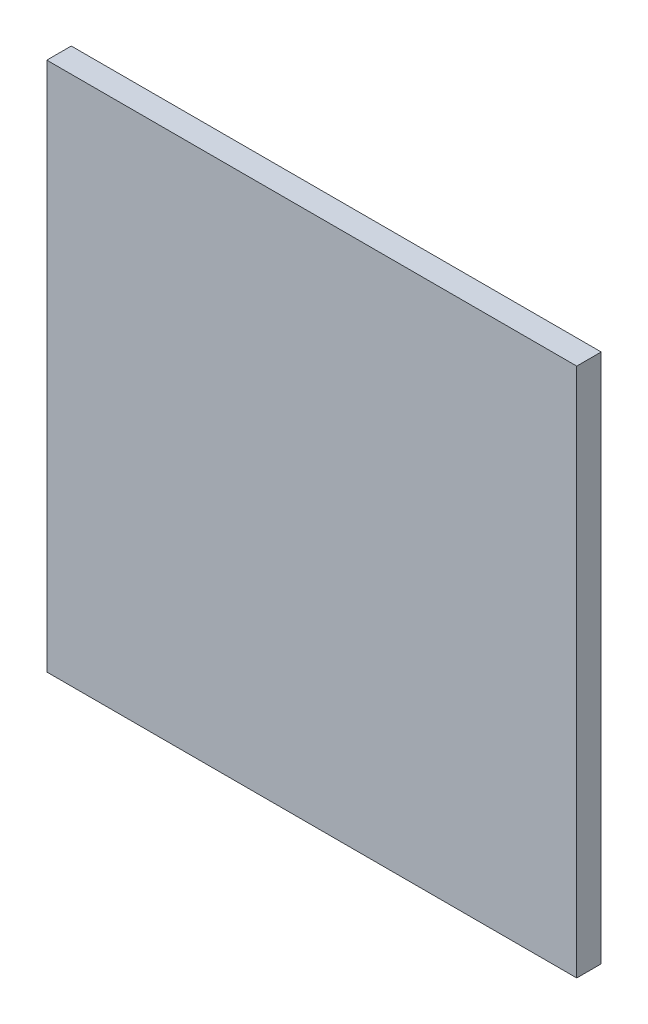
ISO-10303-21;
HEADER;
FILE_DESCRIPTION(('STEP AP214'),'2;1');
FILE_NAME('part.step','',(''),(''),'','','');
FILE_SCHEMA(('AUTOMOTIVE_DESIGN { 1 0 10303 214 1 1 1 1 }'));
ENDSEC;
DATA;
#1=APPLICATION_CONTEXT('core data for automotive mechanical design processes');
#2=APPLICATION_PROTOCOL_DEFINITION('international standard','automotive_design',2000,#1);
#3=PRODUCT_CONTEXT('',#1,'mechanical');
#4=PRODUCT('Part','Part','',(#3));
#5=PRODUCT_RELATED_PRODUCT_CATEGORY('part','',(#4));
#6=PRODUCT_DEFINITION_FORMATION('','',#4);
#7=PRODUCT_DEFINITION_CONTEXT('part definition',#1,'design');
#8=PRODUCT_DEFINITION('design','',#6,#7);
#9=PRODUCT_DEFINITION_SHAPE('','',#8);
#10=(LENGTH_UNIT() NAMED_UNIT(*) SI_UNIT(.MILLI.,.METRE.));
#11=(NAMED_UNIT(*) PLANE_ANGLE_UNIT() SI_UNIT($,.RADIAN.));
#12=(NAMED_UNIT(*) SI_UNIT($,.STERADIAN.) SOLID_ANGLE_UNIT());
#13=UNCERTAINTY_MEASURE_WITH_UNIT(LENGTH_MEASURE(1.E-05),#10,'distance_accuracy_value','');
#14=(GEOMETRIC_REPRESENTATION_CONTEXT(3) GLOBAL_UNCERTAINTY_ASSIGNED_CONTEXT((#13)) GLOBAL_UNIT_ASSIGNED_CONTEXT((#10,
#11,#12)) REPRESENTATION_CONTEXT('',''));
#15=CARTESIAN_POINT('',(0.,0.,0.));
#16=DIRECTION('',(0.,0.,1.));
#17=DIRECTION('',(1.,0.,0.));
#18=AXIS2_PLACEMENT_3D('',#15,#16,#17);
#19=CARTESIAN_POINT('',(32.5,-32.5,3.));
#20=DIRECTION('',(-1.,0.,0.));
#21=DIRECTION('',(0.,0.,1.));
#22=AXIS2_PLACEMENT_3D('',#19,#20,#21);
#23=PLANE('',#22);
#24=DIRECTION('',(0.,1.,0.));
#25=VECTOR('',#24,1.);
#26=CARTESIAN_POINT('',(32.5,-32.5,0.));
#27=LINE('',#26,#25);
#28=CARTESIAN_POINT('',(32.5,-32.5,0.));
#29=VERTEX_POINT('',#28);
#30=CARTESIAN_POINT('',(32.5,32.5,0.));
#31=VERTEX_POINT('',#30);
#32=EDGE_CURVE('E100',#29,#31,#27,.T.);
#33=ORIENTED_EDGE('',*,*,#32,.T.);
#34=DIRECTION('',(0.,0.,-1.));
#35=VECTOR('',#34,1.);
#36=CARTESIAN_POINT('',(32.5,32.5,3.));
#37=LINE('',#36,#35);
#38=CARTESIAN_POINT('',(32.5,32.5,3.));
#39=VERTEX_POINT('',#38);
#40=EDGE_CURVE('E11',#39,#31,#37,.T.);
#41=ORIENTED_EDGE('',*,*,#40,.F.);
#42=DIRECTION('',(0.,1.,0.));
#43=VECTOR('',#42,1.);
#44=CARTESIAN_POINT('',(32.5,-32.5,3.));
#45=LINE('',#44,#43);
#46=CARTESIAN_POINT('',(32.5,-32.5,3.));
#47=VERTEX_POINT('',#46);
#48=EDGE_CURVE('E88',#47,#39,#45,.T.);
#49=ORIENTED_EDGE('',*,*,#48,.F.);
#50=DIRECTION('',(0.,0.,-1.));
#51=VECTOR('',#50,1.);
#52=CARTESIAN_POINT('',(32.5,-32.5,3.));
#53=LINE('',#52,#51);
#54=EDGE_CURVE('E96',#47,#29,#53,.T.);
#55=ORIENTED_EDGE('',*,*,#54,.T.);
#56=EDGE_LOOP('',(#33,#41,#49,#55));
#57=FACE_BOUND('',#56,.T.);
#58=ADVANCED_FACE('F37',(#57),#23,.F.);
#59=CARTESIAN_POINT('',(-32.5,32.5,3.));
#60=DIRECTION('',(0.,-1.,0.));
#61=DIRECTION('',(0.,0.,-1.));
#62=AXIS2_PLACEMENT_3D('',#59,#60,#61);
#63=PLANE('',#62);
#64=DIRECTION('',(-1.,0.,0.));
#65=VECTOR('',#64,1.);
#66=CARTESIAN_POINT('',(-32.5,32.5,0.));
#67=LINE('',#66,#65);
#68=CARTESIAN_POINT('',(-32.5,32.5,0.));
#69=VERTEX_POINT('',#68);
#70=EDGE_CURVE('E92',#31,#69,#67,.T.);
#71=ORIENTED_EDGE('',*,*,#70,.T.);
#72=DIRECTION('',(0.,0.,-1.));
#73=VECTOR('',#72,1.);
#74=CARTESIAN_POINT('',(-32.5,32.5,3.));
#75=LINE('',#74,#73);
#76=CARTESIAN_POINT('',(-32.5,32.5,3.));
#77=VERTEX_POINT('',#76);
#78=EDGE_CURVE('E45',#77,#69,#75,.T.);
#79=ORIENTED_EDGE('',*,*,#78,.F.);
#80=DIRECTION('',(-1.,0.,0.));
#81=VECTOR('',#80,1.);
#82=CARTESIAN_POINT('',(-32.5,32.5,3.));
#83=LINE('',#82,#81);
#84=EDGE_CURVE('E83',#39,#77,#83,.T.);
#85=ORIENTED_EDGE('',*,*,#84,.F.);
#86=ORIENTED_EDGE('',*,*,#40,.T.);
#87=EDGE_LOOP('',(#71,#79,#85,#86));
#88=FACE_BOUND('',#87,.T.);
#89=ADVANCED_FACE('F91',(#88),#63,.F.);
#90=CARTESIAN_POINT('',(-32.5,-32.5,3.));
#91=DIRECTION('',(1.,0.,0.));
#92=DIRECTION('',(0.,0.,-1.));
#93=AXIS2_PLACEMENT_3D('',#90,#91,#92);
#94=PLANE('',#93);
#95=DIRECTION('',(0.,-1.,0.));
#96=VECTOR('',#95,1.);
#97=CARTESIAN_POINT('',(-32.5,-32.5,0.));
#98=LINE('',#97,#96);
#99=CARTESIAN_POINT('',(-32.5,-32.5,0.));
#100=VERTEX_POINT('',#99);
#101=EDGE_CURVE('E70',#69,#100,#98,.T.);
#102=ORIENTED_EDGE('',*,*,#101,.T.);
#103=DIRECTION('',(0.,0.,-1.));
#104=VECTOR('',#103,1.);
#105=CARTESIAN_POINT('',(-32.5,-32.5,3.));
#106=LINE('',#105,#104);
#107=CARTESIAN_POINT('',(-32.5,-32.5,3.));
#108=VERTEX_POINT('',#107);
#109=EDGE_CURVE('E93',#108,#100,#106,.T.);
#110=ORIENTED_EDGE('',*,*,#109,.F.);
#111=DIRECTION('',(0.,-1.,0.));
#112=VECTOR('',#111,1.);
#113=CARTESIAN_POINT('',(-32.5,-32.5,3.));
#114=LINE('',#113,#112);
#115=EDGE_CURVE('E86',#77,#108,#114,.T.);
#116=ORIENTED_EDGE('',*,*,#115,.F.);
#117=ORIENTED_EDGE('',*,*,#78,.T.);
#118=EDGE_LOOP('',(#102,#110,#116,#117));
#119=FACE_BOUND('',#118,.T.);
#120=ADVANCED_FACE('F94',(#119),#94,.F.);
#121=CARTESIAN_POINT('',(-32.5,-32.5,3.));
#122=DIRECTION('',(0.,1.,0.));
#123=DIRECTION('',(0.,0.,1.));
#124=AXIS2_PLACEMENT_3D('',#121,#122,#123);
#125=PLANE('',#124);
#126=DIRECTION('',(1.,0.,0.));
#127=VECTOR('',#126,1.);
#128=CARTESIAN_POINT('',(-32.5,-32.5,0.));
#129=LINE('',#128,#127);
#130=EDGE_CURVE('E76',#100,#29,#129,.T.);
#131=ORIENTED_EDGE('',*,*,#130,.T.);
#132=ORIENTED_EDGE('',*,*,#54,.F.);
#133=DIRECTION('',(1.,0.,0.));
#134=VECTOR('',#133,1.);
#135=CARTESIAN_POINT('',(-32.5,-32.5,3.));
#136=LINE('',#135,#134);
#137=EDGE_CURVE('E53',#108,#47,#136,.T.);
#138=ORIENTED_EDGE('',*,*,#137,.F.);
#139=ORIENTED_EDGE('',*,*,#109,.T.);
#140=EDGE_LOOP('',(#131,#132,#138,#139));
#141=FACE_BOUND('',#140,.T.);
#142=ADVANCED_FACE('F107',(#141),#125,.F.);
#143=CARTESIAN_POINT('',(0.,0.,3.));
#144=DIRECTION('',(0.,0.,-1.));
#145=DIRECTION('',(-1.,0.,0.));
#146=AXIS2_PLACEMENT_3D('',#143,#144,#145);
#147=PLANE('',#146);
#148=ORIENTED_EDGE('',*,*,#48,.T.);
#149=ORIENTED_EDGE('',*,*,#84,.T.);
#150=ORIENTED_EDGE('',*,*,#115,.T.);
#151=ORIENTED_EDGE('',*,*,#137,.T.);
#152=EDGE_LOOP('',(#148,#149,#150,#151));
#153=FACE_BOUND('',#152,.T.);
#154=ADVANCED_FACE('F84',(#153),#147,.F.);
#155=CARTESIAN_POINT('',(0.,0.,0.));
#156=DIRECTION('',(0.,0.,-1.));
#157=DIRECTION('',(-1.,0.,0.));
#158=AXIS2_PLACEMENT_3D('',#155,#156,#157);
#159=PLANE('',#158);
#160=ORIENTED_EDGE('',*,*,#32,.F.);
#161=ORIENTED_EDGE('',*,*,#130,.F.);
#162=ORIENTED_EDGE('',*,*,#101,.F.);
#163=ORIENTED_EDGE('',*,*,#70,.F.);
#164=EDGE_LOOP('',(#160,#161,#162,#163));
#165=FACE_BOUND('',#164,.T.);
#166=ADVANCED_FACE('F110',(#165),#159,.T.);
#167=CLOSED_SHELL('',(#58,#89,#120,#142,#154,#166));
#168=MANIFOLD_SOLID_BREP('B2',#167);
#169=ADVANCED_BREP_SHAPE_REPRESENTATION('',(#18,#168),#14);
#170=SHAPE_DEFINITION_REPRESENTATION(#9,#169);
ENDSEC;
END-ISO-10303-21;
